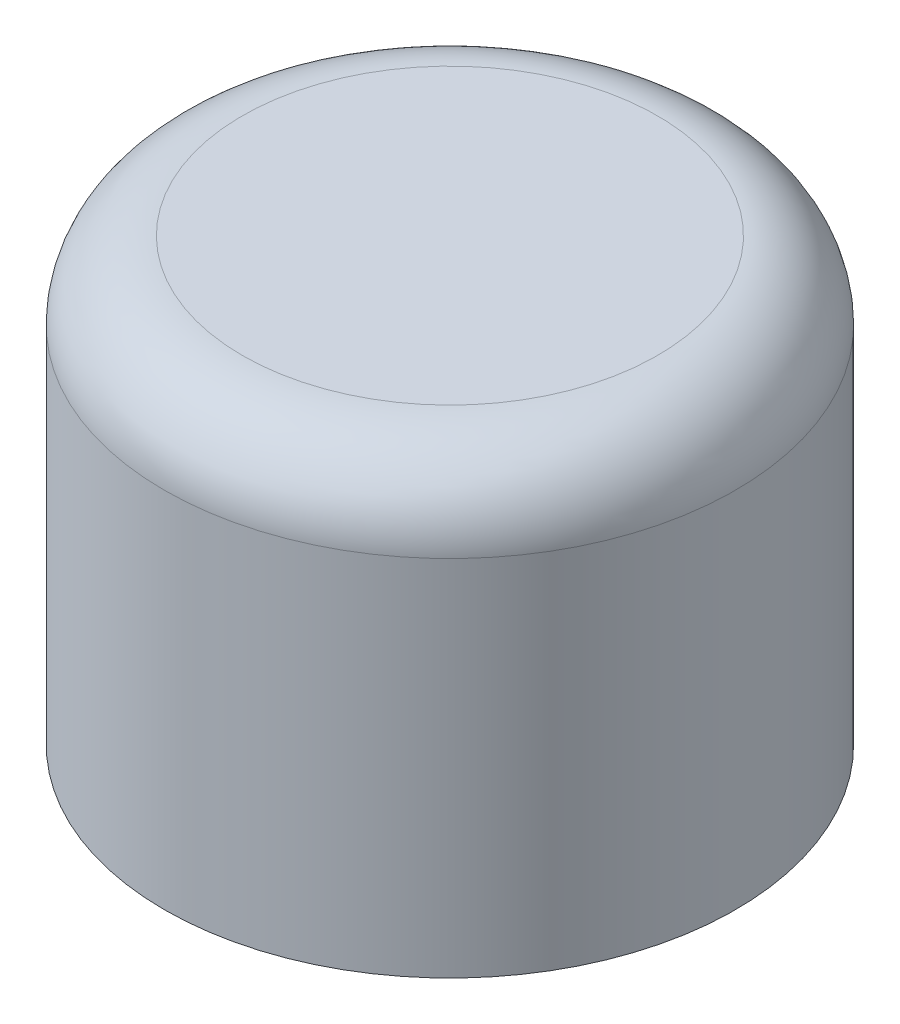
ISO-10303-21;
HEADER;
FILE_DESCRIPTION(('STEP AP214'),'2;1');
FILE_NAME('part.step','',(''),(''),'','','');
FILE_SCHEMA(('AUTOMOTIVE_DESIGN { 1 0 10303 214 1 1 1 1 }'));
ENDSEC;
DATA;
#1=APPLICATION_CONTEXT('core data for automotive mechanical design processes');
#2=APPLICATION_PROTOCOL_DEFINITION('international standard','automotive_design',2000,#1);
#3=PRODUCT_CONTEXT('',#1,'mechanical');
#4=PRODUCT('Part','Part','',(#3));
#5=PRODUCT_RELATED_PRODUCT_CATEGORY('part','',(#4));
#6=PRODUCT_DEFINITION_FORMATION('','',#4);
#7=PRODUCT_DEFINITION_CONTEXT('part definition',#1,'design');
#8=PRODUCT_DEFINITION('design','',#6,#7);
#9=PRODUCT_DEFINITION_SHAPE('','',#8);
#10=(LENGTH_UNIT() NAMED_UNIT(*) SI_UNIT(.MILLI.,.METRE.));
#11=(NAMED_UNIT(*) PLANE_ANGLE_UNIT() SI_UNIT($,.RADIAN.));
#12=(NAMED_UNIT(*) SI_UNIT($,.STERADIAN.) SOLID_ANGLE_UNIT());
#13=UNCERTAINTY_MEASURE_WITH_UNIT(LENGTH_MEASURE(1.E-05),#10,'distance_accuracy_value','');
#14=(GEOMETRIC_REPRESENTATION_CONTEXT(3) GLOBAL_UNCERTAINTY_ASSIGNED_CONTEXT((#13)) GLOBAL_UNIT_ASSIGNED_CONTEXT((#10,
#11,#12)) REPRESENTATION_CONTEXT('',''));
#15=CARTESIAN_POINT('',(0.,0.,0.));
#16=DIRECTION('',(0.,0.,1.));
#17=DIRECTION('',(1.,0.,0.));
#18=AXIS2_PLACEMENT_3D('',#15,#16,#17);
#19=CARTESIAN_POINT('',(0.,8.5,0.));
#20=DIRECTION('',(0.,-1.,0.));
#21=DIRECTION('',(0.,0.,-1.));
#22=AXIS2_PLACEMENT_3D('',#19,#20,#21);
#23=CYLINDRICAL_SURFACE('',#22,5.5);
#24=CARTESIAN_POINT('',(0.,7.,0.));
#25=DIRECTION('',(0.,1.,0.));
#26=DIRECTION('',(0.,0.,1.));
#27=AXIS2_PLACEMENT_3D('',#24,#25,#26);
#28=CIRCLE('',#27,5.5);
#29=CARTESIAN_POINT('',(0.,7.,5.5));
#30=VERTEX_POINT('',#29);
#31=EDGE_CURVE('E10',#30,#30,#28,.F.);
#32=ORIENTED_EDGE('',*,*,#31,.T.);
#33=EDGE_LOOP('',(#32));
#34=FACE_BOUND('',#33,.T.);
#35=CARTESIAN_POINT('',(0.,0.,0.));
#36=DIRECTION('',(0.,1.,0.));
#37=DIRECTION('',(0.,0.,1.));
#38=AXIS2_PLACEMENT_3D('',#35,#36,#37);
#39=CIRCLE('',#38,5.5);
#40=CARTESIAN_POINT('',(0.,0.,5.5));
#41=VERTEX_POINT('',#40);
#42=EDGE_CURVE('E54',#41,#41,#39,.T.);
#43=ORIENTED_EDGE('',*,*,#42,.T.);
#44=EDGE_LOOP('',(#43));
#45=FACE_BOUND('',#44,.T.);
#46=ADVANCED_FACE('F43',(#34,#45),#23,.T.);
#47=CARTESIAN_POINT('',(0.,8.5,0.));
#48=DIRECTION('',(0.,1.,0.));
#49=DIRECTION('',(0.,0.,1.));
#50=AXIS2_PLACEMENT_3D('',#47,#48,#49);
#51=PLANE('',#50);
#52=CARTESIAN_POINT('',(0.,8.5,0.));
#53=DIRECTION('',(0.,1.,0.));
#54=DIRECTION('',(0.,0.,1.));
#55=AXIS2_PLACEMENT_3D('',#52,#53,#54);
#56=CIRCLE('',#55,4.);
#57=CARTESIAN_POINT('',(0.,8.5,4.));
#58=VERTEX_POINT('',#57);
#59=EDGE_CURVE('E50',#58,#58,#56,.T.);
#60=ORIENTED_EDGE('',*,*,#59,.T.);
#61=EDGE_LOOP('',(#60));
#62=FACE_BOUND('',#61,.T.);
#63=ADVANCED_FACE('F79',(#62),#51,.T.);
#64=CARTESIAN_POINT('',(0.,0.,0.));
#65=DIRECTION('',(0.,1.,0.));
#66=DIRECTION('',(0.,0.,1.));
#67=AXIS2_PLACEMENT_3D('',#64,#65,#66);
#68=PLANE('',#67);
#69=CARTESIAN_POINT('',(0.,0.,0.));
#70=DIRECTION('',(0.,1.,0.));
#71=DIRECTION('',(0.,0.,1.));
#72=AXIS2_PLACEMENT_3D('',#69,#70,#71);
#73=CIRCLE('',#72,3.5);
#74=CARTESIAN_POINT('',(0.,0.,3.5));
#75=VERTEX_POINT('',#74);
#76=EDGE_CURVE('E61',#75,#75,#73,.T.);
#77=ORIENTED_EDGE('',*,*,#76,.T.);
#78=EDGE_LOOP('',(#77));
#79=FACE_BOUND('',#78,.T.);
#80=ORIENTED_EDGE('',*,*,#42,.F.);
#81=EDGE_LOOP('',(#80));
#82=FACE_BOUND('',#81,.T.);
#83=ADVANCED_FACE('F83',(#79,#82),#68,.F.);
#84=CARTESIAN_POINT('',(0.,7.,0.));
#85=DIRECTION('',(0.,1.,0.));
#86=DIRECTION('',(0.,0.,1.));
#87=AXIS2_PLACEMENT_3D('',#84,#85,#86);
#88=TOROIDAL_SURFACE('',#87,4.,1.5);
#89=ORIENTED_EDGE('',*,*,#31,.F.);
#90=EDGE_LOOP('',(#89));
#91=FACE_BOUND('',#90,.T.);
#92=ORIENTED_EDGE('',*,*,#59,.F.);
#93=EDGE_LOOP('',(#92));
#94=FACE_BOUND('',#93,.T.);
#95=ADVANCED_FACE('F45',(#91,#94),#88,.T.);
#96=CARTESIAN_POINT('',(0.,8.5,0.));
#97=DIRECTION('',(0.,-1.,0.));
#98=DIRECTION('',(0.,0.,-1.));
#99=AXIS2_PLACEMENT_3D('',#96,#97,#98);
#100=CYLINDRICAL_SURFACE('',#99,3.5);
#101=CARTESIAN_POINT('',(0.,6.5,0.));
#102=DIRECTION('',(0.,1.,0.));
#103=DIRECTION('',(0.,0.,1.));
#104=AXIS2_PLACEMENT_3D('',#101,#102,#103);
#105=CIRCLE('',#104,3.5);
#106=CARTESIAN_POINT('',(0.,6.5,3.5));
#107=VERTEX_POINT('',#106);
#108=EDGE_CURVE('E58',#107,#107,#105,.T.);
#109=ORIENTED_EDGE('',*,*,#108,.T.);
#110=EDGE_LOOP('',(#109));
#111=FACE_BOUND('',#110,.T.);
#112=ORIENTED_EDGE('',*,*,#76,.F.);
#113=EDGE_LOOP('',(#112));
#114=FACE_BOUND('',#113,.T.);
#115=ADVANCED_FACE('F67',(#111,#114),#100,.F.);
#116=CARTESIAN_POINT('',(0.,6.5,0.));
#117=DIRECTION('',(0.,1.,0.));
#118=DIRECTION('',(0.,0.,1.));
#119=AXIS2_PLACEMENT_3D('',#116,#117,#118);
#120=PLANE('',#119);
#121=ORIENTED_EDGE('',*,*,#108,.F.);
#122=EDGE_LOOP('',(#121));
#123=FACE_BOUND('',#122,.T.);
#124=ADVANCED_FACE('F70',(#123),#120,.F.);
#125=CLOSED_SHELL('',(#46,#63,#83,#95,#115,#124));
#126=MANIFOLD_SOLID_BREP('B2',#125);
#127=ADVANCED_BREP_SHAPE_REPRESENTATION('',(#18,#126),#14);
#128=SHAPE_DEFINITION_REPRESENTATION(#9,#127);
ENDSEC;
END-ISO-10303-21;
